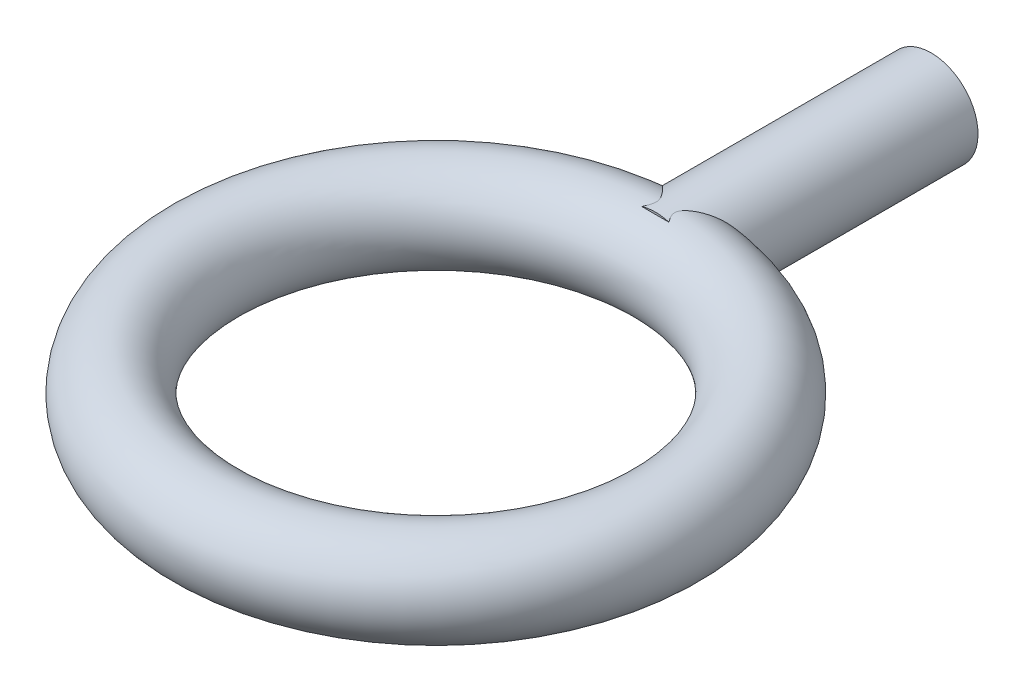
ISO-10303-21;
HEADER;
FILE_DESCRIPTION(('STEP AP214'),'2;1');
FILE_NAME('part.step','',(''),(''),'','','');
FILE_SCHEMA(('AUTOMOTIVE_DESIGN { 1 0 10303 214 1 1 1 1 }'));
ENDSEC;
DATA;
#1=APPLICATION_CONTEXT('core data for automotive mechanical design processes');
#2=APPLICATION_PROTOCOL_DEFINITION('international standard','automotive_design',2000,#1);
#3=PRODUCT_CONTEXT('',#1,'mechanical');
#4=PRODUCT('Part','Part','',(#3));
#5=PRODUCT_RELATED_PRODUCT_CATEGORY('part','',(#4));
#6=PRODUCT_DEFINITION_FORMATION('','',#4);
#7=PRODUCT_DEFINITION_CONTEXT('part definition',#1,'design');
#8=PRODUCT_DEFINITION('design','',#6,#7);
#9=PRODUCT_DEFINITION_SHAPE('','',#8);
#10=(LENGTH_UNIT() NAMED_UNIT(*) SI_UNIT(.MILLI.,.METRE.));
#11=(NAMED_UNIT(*) PLANE_ANGLE_UNIT() SI_UNIT($,.RADIAN.));
#12=(NAMED_UNIT(*) SI_UNIT($,.STERADIAN.) SOLID_ANGLE_UNIT());
#13=UNCERTAINTY_MEASURE_WITH_UNIT(LENGTH_MEASURE(1.E-05),#10,'distance_accuracy_value','');
#14=(GEOMETRIC_REPRESENTATION_CONTEXT(3) GLOBAL_UNCERTAINTY_ASSIGNED_CONTEXT((#13)) GLOBAL_UNIT_ASSIGNED_CONTEXT((#10,
#11,#12)) REPRESENTATION_CONTEXT('',''));
#15=CARTESIAN_POINT('',(0.,0.,0.));
#16=DIRECTION('',(0.,0.,1.));
#17=DIRECTION('',(1.,0.,0.));
#18=AXIS2_PLACEMENT_3D('',#15,#16,#17);
#19=CARTESIAN_POINT('',(-9448.78040350969,-4713.39551359016,184.88063334922));
#20=DIRECTION('',(0.,1.,0.));
#21=DIRECTION('',(1.,0.,0.));
#22=AXIS2_PLACEMENT_3D('',#19,#20,#21);
#23=TOROIDAL_SURFACE('',#22,25.0000000000005,5.00000000000071);
#24=CARTESIAN_POINT('',(-9447.30944943714,-4718.27878033655,161.));
#25=CARTESIAN_POINT('',(-9447.55459893969,-4718.27544619155,161.));
#26=CARTESIAN_POINT('',(-9447.79975997464,-4718.27290227472,161.));
#27=CARTESIAN_POINT('',(-9448.29008184333,-4718.2694816374,161.));
#28=CARTESIAN_POINT('',(-9448.53524267651,-4718.26860483711,161.));
#29=CARTESIAN_POINT('',(-9449.02556434288,-4718.26860483711,161.));
#30=CARTESIAN_POINT('',(-9449.27072517606,-4718.2694816374,161.));
#31=CARTESIAN_POINT('',(-9449.76104704475,-4718.27290227472,161.));
#32=CARTESIAN_POINT('',(-9450.0062080797,-4718.27544619155,161.));
#33=CARTESIAN_POINT('',(-9450.25135758225,-4718.27878033655,161.));
#34=B_SPLINE_CURVE_WITH_KNOTS('',3,(#24,#25,#26,#27,#28,#29,#30,#31,#32,#33),.UNSPECIFIED.,.F.,
.F.,(4,2,2,2,4),(0.,0.735516484941491,1.47099776904942,2.20647905315912,2.94199553810061),.UNSPECIFIED.);
#35=CARTESIAN_POINT('',(-9447.30944943714,-4718.27878033655,161.000000000001));
#36=VERTEX_POINT('',#35);
#37=CARTESIAN_POINT('',(-9450.25135758225,-4718.27878033655,160.999999999999));
#38=VERTEX_POINT('',#37);
#39=EDGE_CURVE('E26',#36,#38,#34,.T.);
#40=ORIENTED_EDGE('',*,*,#39,.F.);
#41=CARTESIAN_POINT('',(-9447.30944943715,-4708.51224684376,161.000000000008));
#42=CARTESIAN_POINT('',(-9447.33903761673,-4708.50333309246,160.957562420116));
#43=CARTESIAN_POINT('',(-9447.36820722333,-4708.49484234722,160.914762244065));
#44=CARTESIAN_POINT('',(-9447.42539862697,-4708.47872091877,160.828119411262));
#45=CARTESIAN_POINT('',(-9447.45341800728,-4708.47109199279,160.784274837682));
#46=CARTESIAN_POINT('',(-9447.53649792305,-4708.44920365253,160.648682296249));
#47=CARTESIAN_POINT('',(-9447.58902489208,-4708.4364035728,160.555023601684));
#48=CARTESIAN_POINT('',(-9447.66435790302,-4708.41902929248,160.394366248359));
#49=CARTESIAN_POINT('',(-9447.69114605554,-4708.4131425815,160.329429780656));
#50=CARTESIAN_POINT('',(-9447.73512578985,-4708.40373002261,160.196584489065));
#51=CARTESIAN_POINT('',(-9447.7523922944,-4708.40018569803,160.128703540749));
#52=CARTESIAN_POINT('',(-9447.77187577721,-4708.39621747477,160.002399481328));
#53=CARTESIAN_POINT('',(-9447.77614797412,-4708.39536641084,159.944324085666));
#54=CARTESIAN_POINT('',(-9447.77447450423,-4708.39570286402,159.828328584058));
#55=CARTESIAN_POINT('',(-9447.76852964131,-4708.39689022077,159.770408466255));
#56=CARTESIAN_POINT('',(-9447.74447649301,-4708.40181411022,159.640377603409));
#57=CARTESIAN_POINT('',(-9447.72341728568,-4708.40617372111,159.568857748581));
#58=CARTESIAN_POINT('',(-9447.6708053969,-4708.4176115032,159.429866407007));
#59=CARTESIAN_POINT('',(-9447.63919679043,-4708.42470419479,159.362418807975));
#60=CARTESIAN_POINT('',(-9447.5542593564,-4708.44483716139,159.202547262555));
#61=CARTESIAN_POINT('',(-9447.49748814823,-4708.45912146114,159.112163816446));
#62=CARTESIAN_POINT('',(-9447.3771263745,-4708.49196821408,158.936793222484));
#63=CARTESIAN_POINT('',(-9447.31351944144,-4708.51054106352,158.851819838819));
#64=CARTESIAN_POINT('',(-9447.18227313178,-4708.55188464423,158.685372950133));
#65=CARTESIAN_POINT('',(-9447.11461402137,-4708.57467727968,158.603920576379));
#66=CARTESIAN_POINT('',(-9446.97732092495,-4708.62432579034,158.444157622314));
#67=CARTESIAN_POINT('',(-9446.90768897499,-4708.65117759215,158.365843990815));
#68=CARTESIAN_POINT('',(-9446.70374077535,-4708.73521728249,158.141761267105));
#69=CARTESIAN_POINT('',(-9446.56804459318,-4708.79782858307,157.999242054888));
#70=CARTESIAN_POINT('',(-9446.29682078204,-4708.93846877123,157.721633195896));
#71=CARTESIAN_POINT('',(-9446.16129339718,-4709.01651082618,157.586550021173));
#72=CARTESIAN_POINT('',(-9445.89351732705,-4709.18824794384,157.324364232755));
#73=CARTESIAN_POINT('',(-9445.76125869373,-4709.2818863383,157.197234939974));
#74=CARTESIAN_POINT('',(-9445.5019155322,-4709.48543713469,156.951205624107));
#75=CARTESIAN_POINT('',(-9445.37482778887,-4709.59533922083,156.832300454239));
#76=CARTESIAN_POINT('',(-9445.07600481118,-4709.8817688946,156.555575108096));
#77=CARTESIAN_POINT('',(-9444.90798019993,-4710.06687411321,156.402428975922));
#78=CARTESIAN_POINT('',(-9444.594431931,-4710.47097211993,156.119603232386));
#79=CARTESIAN_POINT('',(-9444.44888600661,-4710.68993093769,155.989900376832));
#80=CARTESIAN_POINT('',(-9444.21050820354,-4711.12044277107,155.779023044446));
#81=CARTESIAN_POINT('',(-9444.11293139495,-4711.32711285862,155.693360574929));
#82=CARTESIAN_POINT('',(-9443.98665447325,-4711.65096310493,155.582975189822));
#83=CARTESIAN_POINT('',(-9443.94790095442,-4711.76125853453,155.549190137937));
#84=CARTESIAN_POINT('',(-9443.87767862639,-4711.98586543795,155.488083241158));
#85=CARTESIAN_POINT('',(-9443.8462067007,-4712.10017516945,155.460758631114));
#86=CARTESIAN_POINT('',(-9443.79091131746,-4712.33280255866,155.412814883419));
#87=CARTESIAN_POINT('',(-9443.76713727832,-4712.45114092422,155.392239060692));
#88=CARTESIAN_POINT('',(-9443.72796310668,-4712.69017417318,155.358364337804));
#89=CARTESIAN_POINT('',(-9443.7125591851,-4712.81086796463,155.345062144925));
#90=CARTESIAN_POINT('',(-9443.69041645015,-4713.05362720266,155.325947823345));
#91=CARTESIAN_POINT('',(-9443.68367680368,-4713.17569251623,155.320134974514));
#92=CARTESIAN_POINT('',(-9443.67899862129,-4713.42011175764,155.316099614594));
#93=CARTESIAN_POINT('',(-9443.68105935348,-4713.54246566064,155.317876472303));
#94=CARTESIAN_POINT('',(-9443.6932979095,-4713.7742859702,155.328435781431));
#95=CARTESIAN_POINT('',(-9443.70265255648,-4713.88382986226,155.336507792651));
#96=CARTESIAN_POINT('',(-9443.72831744475,-4714.10151803997,155.358674100103));
#97=CARTESIAN_POINT('',(-9443.74462990476,-4714.20966186782,155.372770317339));
#98=CARTESIAN_POINT('',(-9443.78394791048,-4714.42374887789,155.406790792478));
#99=CARTESIAN_POINT('',(-9443.80695084797,-4714.52969290046,155.42671277927));
#100=CARTESIAN_POINT('',(-9443.85930292495,-4714.73879589766,155.472129752645));
#101=CARTESIAN_POINT('',(-9443.88865444395,-4714.84195381167,155.49762682887));
#102=CARTESIAN_POINT('',(-9443.9867724157,-4715.14992393764,155.583034373733));
#103=CARTESIAN_POINT('',(-9444.06491436011,-4715.34956425077,155.651269489411));
#104=CARTESIAN_POINT('',(-9444.2418682176,-4715.73133841656,155.806734841394));
#105=CARTESIAN_POINT('',(-9444.34068601273,-4715.91346726582,155.893970483428));
#106=CARTESIAN_POINT('',(-9444.52264961513,-4716.20650947593,156.055839757581));
#107=CARTESIAN_POINT('',(-9444.60158047725,-4716.32237584292,156.126381885924));
#108=CARTESIAN_POINT('',(-9444.76624451561,-4716.54442663973,156.274442206407));
#109=CARTESIAN_POINT('',(-9444.85197986745,-4716.65060794942,156.351962630794));
#110=CARTESIAN_POINT('',(-9445.11802148595,-4716.95495028223,156.594194164234));
#111=CARTESIAN_POINT('',(-9445.30685732808,-4717.13843114039,156.768305525499));
#112=CARTESIAN_POINT('',(-9445.62753140314,-4717.40752226204,157.069881082635));
#113=CARTESIAN_POINT('',(-9445.75547903759,-4717.50461423681,157.191636620477));
#114=CARTESIAN_POINT('',(-9446.01496066544,-4717.68353425414,157.442578632246));
#115=CARTESIAN_POINT('',(-9446.14649663229,-4717.76535369524,157.57176924033));
#116=CARTESIAN_POINT('',(-9446.41024582985,-4717.91383066599,157.836716531889));
#117=CARTESIAN_POINT('',(-9446.54245449586,-4717.98054542114,157.972445987266));
#118=CARTESIAN_POINT('',(-9446.80514276796,-4718.0996616894,158.251492493087));
#119=CARTESIAN_POINT('',(-9446.9356237956,-4718.15207576884,158.394802749025));
#120=CARTESIAN_POINT('',(-9447.13357279754,-4718.22290228676,158.626537265018));
#121=CARTESIAN_POINT('',(-9447.20351910996,-4718.24613129057,158.71138536426));
#122=CARTESIAN_POINT('',(-9447.33948349026,-4718.28824523334,158.88607039278));
#123=CARTESIAN_POINT('',(-9447.40547822334,-4718.30710595593,158.975931859379));
#124=CARTESIAN_POINT('',(-9447.53040570251,-4718.34037992361,159.16376757283));
#125=CARTESIAN_POINT('',(-9447.58918821253,-4718.35470605974,159.261859628681));
#126=CARTESIAN_POINT('',(-9447.68835850479,-4718.3774841263,159.46727745636));
#127=CARTESIAN_POINT('',(-9447.72895907986,-4718.3860046538,159.574477942888));
#128=CARTESIAN_POINT('',(-9447.765280553,-4718.39348498807,159.74616960413));
#129=CARTESIAN_POINT('',(-9447.77302237578,-4718.39503232899,159.80785859238));
#130=CARTESIAN_POINT('',(-9447.77684622424,-4718.39580118316,159.931576761239));
#131=CARTESIAN_POINT('',(-9447.77293564193,-4718.39502417093,159.993605701269));
#132=CARTESIAN_POINT('',(-9447.7524471772,-4718.39085410138,160.130576212345));
#133=CARTESIAN_POINT('',(-9447.73306046229,-4718.38687921098,160.205053411579));
#134=CARTESIAN_POINT('',(-9447.68323182424,-4718.37616162304,160.350549176941));
#135=CARTESIAN_POINT('',(-9447.65267756131,-4718.36939070573,160.421523970317));
#136=CARTESIAN_POINT('',(-9447.57433431222,-4718.35106308725,160.581712389187));
#137=CARTESIAN_POINT('',(-9447.52414872796,-4718.3386705566,160.669621007936));
#138=CARTESIAN_POINT('',(-9447.44528344843,-4718.3177270466,160.797066458597));
#139=CARTESIAN_POINT('',(-9447.41879725205,-4718.31047222303,160.838257062376));
#140=CARTESIAN_POINT('',(-9447.3648129131,-4718.29519594104,160.919739848418));
#141=CARTESIAN_POINT('',(-9447.33731627832,-4718.28717559847,160.960033235891));
#142=CARTESIAN_POINT('',(-9447.30944943714,-4718.27878033655,161.000000000002));
#143=B_SPLINE_CURVE_WITH_KNOTS('',3,(#41,#42,#43,#44,#45,#46,#47,#48,#49,#50,#51,#52,#53,#54,
#55,#56,#57,#58,#59,#60,#61,#62,#63,#64,#65,#66,#67,#68,#69,#70,#71,#72,#73,#74,#75,#76,#77,#78,
#79,#80,#81,#82,#83,#84,#85,#86,#87,#88,#89,#90,#91,#92,#93,#94,#95,#96,#97,#98,#99,#100,#101,
#102,#103,#104,#105,#106,#107,#108,#109,#110,#111,#112,#113,#114,#115,#116,#117,#118,#119,#120,
#121,#122,#123,#124,#125,#126,#127,#128,#129,#130,#131,#132,#133,#134,#135,#136,#137,#138,#139,
#140,#141,#142),.UNSPECIFIED.,.F.,.F.,(4,2,2,2,2,2,2,2,2,2,2,2,2,2,2,2,2,2,2,2,2,2,2,2,2,2,2,2,
2,2,2,2,2,2,2,2,2,2,2,2,2,2,2,2,2,2,2,2,2,2,4),(0.,0.157448450916207,0.315212353302046,
0.638803870081451,0.849807036323482,1.05912529262953,1.23295511469861,1.40677126038031,
1.62947728289162,1.85338319216691,2.17562659583058,2.49865953615247,2.82341885366418,
3.14785440968087,3.7665849841779,4.38584583028893,5.0029038476564,5.61957213975953,
6.49568025533015,7.37091487979263,8.09981026815847,8.46449339988881,8.82902015897188,
9.19584270934776,9.56249906412587,9.92912016084125,10.2957107679963,10.6260352415575,
10.9564651279786,11.286766371365,11.6171916303794,12.2892486156102,12.9614970542456,
13.4317178325402,13.9020895652943,14.8446964295472,15.4487229445937,16.0530886267304,
16.6551248011441,17.2566302365458,17.5936326915517,17.9324609043048,18.2774503415342,
18.6182893259175,18.8037875352837,18.9891680938185,19.2189357224442,19.4510813410273,
19.7564208624658,19.9049306771762,20.0532272287011),.UNSPECIFIED.);
#144=CARTESIAN_POINT('',(-9447.30944943715,-4708.51224684376,161.000000000004));
#145=VERTEX_POINT('',#144);
#146=EDGE_CURVE('E35',#145,#36,#143,.T.);
#147=ORIENTED_EDGE('',*,*,#146,.F.);
#148=CARTESIAN_POINT('',(-9447.30944943714,-4708.51224684376,161.));
#149=CARTESIAN_POINT('',(-9447.55459893969,-4708.51558098877,161.));
#150=CARTESIAN_POINT('',(-9447.79975997464,-4708.51812490559,161.));
#151=CARTESIAN_POINT('',(-9448.29008184333,-4708.52154554292,161.));
#152=CARTESIAN_POINT('',(-9448.53524267651,-4708.52242234321,161.));
#153=CARTESIAN_POINT('',(-9449.02556434288,-4708.52242234321,161.));
#154=CARTESIAN_POINT('',(-9449.27072517606,-4708.52154554292,161.));
#155=CARTESIAN_POINT('',(-9449.76104704475,-4708.51812490559,161.));
#156=CARTESIAN_POINT('',(-9450.0062080797,-4708.51558098877,161.));
#157=CARTESIAN_POINT('',(-9450.25135758225,-4708.51224684376,161.));
#158=B_SPLINE_CURVE_WITH_KNOTS('',3,(#148,#149,#150,#151,#152,#153,#154,#155,#156,#157),
.UNSPECIFIED.,.F.,.F.,(4,2,2,2,4),(0.,0.735516484941491,1.47099776904942,2.20647905315912,
2.94199553810061),.UNSPECIFIED.);
#159=CARTESIAN_POINT('',(-9450.25135758225,-4708.51224684376,161.000000000002));
#160=VERTEX_POINT('',#159);
#161=EDGE_CURVE('E9',#145,#160,#158,.T.);
#162=ORIENTED_EDGE('',*,*,#161,.T.);
#163=CARTESIAN_POINT('',(-9450.25135758225,-4718.27878033656,160.999999999998));
#164=CARTESIAN_POINT('',(-9450.22176940267,-4718.28769408786,160.957562420106));
#165=CARTESIAN_POINT('',(-9450.19259979608,-4718.2961848331,160.914762244054));
#166=CARTESIAN_POINT('',(-9450.13540839243,-4718.31230626155,160.828119411251));
#167=CARTESIAN_POINT('',(-9450.10738901213,-4718.31993518752,160.784274837671));
#168=CARTESIAN_POINT('',(-9450.02430909636,-4718.34182352778,160.648682296238));
#169=CARTESIAN_POINT('',(-9449.97178212734,-4718.35462360752,160.555023601672));
#170=CARTESIAN_POINT('',(-9449.8964491164,-4718.37199788784,160.394366248346));
#171=CARTESIAN_POINT('',(-9449.86966096387,-4718.37788459882,160.329429780642));
#172=CARTESIAN_POINT('',(-9449.82568122956,-4718.3872971577,160.196584489051));
#173=CARTESIAN_POINT('',(-9449.80841472502,-4718.39084148229,160.128703540734));
#174=CARTESIAN_POINT('',(-9449.78893124221,-4718.39480970554,160.002399481312));
#175=CARTESIAN_POINT('',(-9449.7846590453,-4718.39566076948,159.944324085648));
#176=CARTESIAN_POINT('',(-9449.7863325152,-4718.39532431629,159.828328584038));
#177=CARTESIAN_POINT('',(-9449.79227737812,-4718.39413695955,159.770408466234));
#178=CARTESIAN_POINT('',(-9449.81633052642,-4718.3892130701,159.640377603383));
#179=CARTESIAN_POINT('',(-9449.83738973375,-4718.38485345921,159.568857748552));
#180=CARTESIAN_POINT('',(-9449.89000162253,-4718.37341567712,159.429866406973));
#181=CARTESIAN_POINT('',(-9449.92161022901,-4718.36632298552,159.362418807938));
#182=CARTESIAN_POINT('',(-9450.00654766305,-4718.34619001892,159.202547262509));
#183=CARTESIAN_POINT('',(-9450.06331887122,-4718.33190571916,159.112163816394));
#184=CARTESIAN_POINT('',(-9450.18368064496,-4718.29905896622,158.936793222422));
#185=CARTESIAN_POINT('',(-9450.24728757802,-4718.28048611678,158.851819838752));
#186=CARTESIAN_POINT('',(-9450.3785338877,-4718.23914253606,158.685372950057));
#187=CARTESIAN_POINT('',(-9450.44619299812,-4718.21634990061,158.603920576297));
#188=CARTESIAN_POINT('',(-9450.58348609455,-4718.16670138994,158.444157622222));
#189=CARTESIAN_POINT('',(-9450.65311804451,-4718.13984958813,158.365843990718));
#190=CARTESIAN_POINT('',(-9450.85706624416,-4718.05580989778,158.141761267007));
#191=CARTESIAN_POINT('',(-9450.99276242631,-4717.9931985972,157.999242054794));
#192=CARTESIAN_POINT('',(-9451.26398623745,-4717.85255840903,157.721633195807));
#193=CARTESIAN_POINT('',(-9451.39951362231,-4717.77451635408,157.586550021086));
#194=CARTESIAN_POINT('',(-9451.66728969244,-4717.60277923642,157.324364232673));
#195=CARTESIAN_POINT('',(-9451.79954832576,-4717.50914084195,157.197234939895));
#196=CARTESIAN_POINT('',(-9452.05889148728,-4717.30559004555,156.951205624033));
#197=CARTESIAN_POINT('',(-9452.18597923061,-4717.19568795942,156.832300454169));
#198=CARTESIAN_POINT('',(-9452.4848022083,-4716.90925828564,156.555575108033));
#199=CARTESIAN_POINT('',(-9452.65282681954,-4716.72415306703,156.402428975865));
#200=CARTESIAN_POINT('',(-9452.96637508845,-4716.3200550603,156.11960323234));
#201=CARTESIAN_POINT('',(-9453.11192101284,-4716.10109624254,155.98990037679));
#202=CARTESIAN_POINT('',(-9453.3502988159,-4715.67058440916,155.779023044413));
#203=CARTESIAN_POINT('',(-9453.44787562449,-4715.46391432162,155.693360574899));
#204=CARTESIAN_POINT('',(-9453.57415254618,-4715.1400640753,155.582975189799));
#205=CARTESIAN_POINT('',(-9453.612906065,-4715.02976864571,155.549190137915));
#206=CARTESIAN_POINT('',(-9453.68312839303,-4714.80516174229,155.488083241139));
#207=CARTESIAN_POINT('',(-9453.71460031872,-4714.69085201078,155.460758631097));
#208=CARTESIAN_POINT('',(-9453.76989570196,-4714.45822462158,155.412814883406));
#209=CARTESIAN_POINT('',(-9453.79366974109,-4714.33988625602,155.392239060681));
#210=CARTESIAN_POINT('',(-9453.83284391273,-4714.10085300705,155.358364337797));
#211=CARTESIAN_POINT('',(-9453.84824783431,-4713.98015921561,155.345062144919));
#212=CARTESIAN_POINT('',(-9453.87039056925,-4713.73739997758,155.325947823342));
#213=CARTESIAN_POINT('',(-9453.87713021572,-4713.61533466401,155.320134974514));
#214=CARTESIAN_POINT('',(-9453.88180839811,-4713.3709154226,155.316099614596));
#215=CARTESIAN_POINT('',(-9453.87974766592,-4713.24856151961,155.317876472306));
#216=CARTESIAN_POINT('',(-9453.86750910989,-4713.01674121005,155.328435781438));
#217=CARTESIAN_POINT('',(-9453.85815446292,-4712.90719731799,155.336507792659));
#218=CARTESIAN_POINT('',(-9453.83248957464,-4712.68950914028,155.358674100113));
#219=CARTESIAN_POINT('',(-9453.81617711463,-4712.58136531243,155.372770317351));
#220=CARTESIAN_POINT('',(-9453.7768591089,-4712.36727830236,155.406790792492));
#221=CARTESIAN_POINT('',(-9453.75385617141,-4712.26133427979,155.426712779285));
#222=CARTESIAN_POINT('',(-9453.70150409443,-4712.05223128259,155.472129752662));
#223=CARTESIAN_POINT('',(-9453.67215257543,-4711.94907336858,155.497626828888));
#224=CARTESIAN_POINT('',(-9453.57403460368,-4711.64110324261,155.583034373754));
#225=CARTESIAN_POINT('',(-9453.49589265926,-4711.44146292948,155.651269489435));
#226=CARTESIAN_POINT('',(-9453.31893880177,-4711.0596887637,155.806734841422));
#227=CARTESIAN_POINT('',(-9453.22012100663,-4710.87755991443,155.893970483458));
#228=CARTESIAN_POINT('',(-9453.03815740423,-4710.58451770433,156.055839757615));
#229=CARTESIAN_POINT('',(-9452.9592265421,-4710.46865133734,156.12638188596));
#230=CARTESIAN_POINT('',(-9452.79456250374,-4710.24660054053,156.274442206447));
#231=CARTESIAN_POINT('',(-9452.7088271519,-4710.14041923084,156.351962630836));
#232=CARTESIAN_POINT('',(-9452.4427855334,-4709.83607689804,156.594194164282));
#233=CARTESIAN_POINT('',(-9452.25394969126,-4709.65259603988,156.768305525551));
#234=CARTESIAN_POINT('',(-9451.93327561619,-4709.38350491823,157.069881082692));
#235=CARTESIAN_POINT('',(-9451.80532798174,-4709.28641294347,157.191636620535));
#236=CARTESIAN_POINT('',(-9451.54584635388,-4709.10749292613,157.442578632307));
#237=CARTESIAN_POINT('',(-9451.41431038704,-4709.02567348503,157.571769240394));
#238=CARTESIAN_POINT('',(-9451.15056118947,-4708.87719651429,157.836716531957));
#239=CARTESIAN_POINT('',(-9451.01835252346,-4708.81048175915,157.972445987337));
#240=CARTESIAN_POINT('',(-9450.75566425136,-4708.69136549088,158.251492493163));
#241=CARTESIAN_POINT('',(-9450.62518322372,-4708.63895141145,158.394802749103));
#242=CARTESIAN_POINT('',(-9450.42723422178,-4708.56812489354,158.626537265096));
#243=CARTESIAN_POINT('',(-9450.35728790937,-4708.54489588972,158.711385364333));
#244=CARTESIAN_POINT('',(-9450.22132352908,-4708.50278194696,158.886070392848));
#245=CARTESIAN_POINT('',(-9450.155328796,-4708.48392122438,158.975931859445));
#246=CARTESIAN_POINT('',(-9450.03040131683,-4708.4506472567,159.163767572891));
#247=CARTESIAN_POINT('',(-9449.97161880682,-4708.43632112056,159.261859628739));
#248=CARTESIAN_POINT('',(-9449.87244851457,-4708.41354305401,159.467277456412));
#249=CARTESIAN_POINT('',(-9449.8318479395,-4708.40502252651,159.574477942936));
#250=CARTESIAN_POINT('',(-9449.79552646637,-4708.39754219224,159.746169604173));
#251=CARTESIAN_POINT('',(-9449.78778464359,-4708.39599485132,159.807858592422));
#252=CARTESIAN_POINT('',(-9449.78396079514,-4708.39522599715,159.931576761279));
#253=CARTESIAN_POINT('',(-9449.78787137745,-4708.39600300938,159.993605701307));
#254=CARTESIAN_POINT('',(-9449.80835984218,-4708.40017307893,160.130576212384));
#255=CARTESIAN_POINT('',(-9449.8277465571,-4708.40414796934,160.20505341162));
#256=CARTESIAN_POINT('',(-9449.87757519516,-4708.41486555728,160.350549176985));
#257=CARTESIAN_POINT('',(-9449.90812945809,-4708.42163647459,160.421523970362));
#258=CARTESIAN_POINT('',(-9449.98647270719,-4708.43996409307,160.581712389225));
#259=CARTESIAN_POINT('',(-9450.03665829144,-4708.45235662372,160.669621007966));
#260=CARTESIAN_POINT('',(-9450.11552357097,-4708.47330013372,160.797066458616));
#261=CARTESIAN_POINT('',(-9450.14200976735,-4708.48055495729,160.838257062391));
#262=CARTESIAN_POINT('',(-9450.19599410629,-4708.49583123928,160.919739848426));
#263=CARTESIAN_POINT('',(-9450.22349074107,-4708.50385158185,160.960033235896));
#264=CARTESIAN_POINT('',(-9450.25135758224,-4708.51224684376,161.000000000004));
#265=B_SPLINE_CURVE_WITH_KNOTS('',3,(#163,#164,#165,#166,#167,#168,#169,#170,#171,#172,#173,
#174,#175,#176,#177,#178,#179,#180,#181,#182,#183,#184,#185,#186,#187,#188,#189,#190,#191,#192,
#193,#194,#195,#196,#197,#198,#199,#200,#201,#202,#203,#204,#205,#206,#207,#208,#209,#210,#211,
#212,#213,#214,#215,#216,#217,#218,#219,#220,#221,#222,#223,#224,#225,#226,#227,#228,#229,#230,
#231,#232,#233,#234,#235,#236,#237,#238,#239,#240,#241,#242,#243,#244,#245,#246,#247,#248,#249,
#250,#251,#252,#253,#254,#255,#256,#257,#258,#259,#260,#261,#262,#263,#264),.UNSPECIFIED.,.F.,
.F.,(4,2,2,2,2,2,2,2,2,2,2,2,2,2,2,2,2,2,2,2,2,2,2,2,2,2,2,2,2,2,2,2,2,2,2,2,2,2,2,2,2,2,2,2,2,
2,2,2,2,2,4),(0.,0.157448450917453,0.315212353301779,0.638803870080117,0.849807036322691,
1.05912529262886,1.2329551147018,1.40677126038738,1.62947728290929,1.85338319219533,
2.17562659588271,2.49865953622655,2.82341885376188,3.14785440980182,3.76658498429131,
4.38584583039854,5.00290384776081,5.61957213985715,6.49568025541369,7.37091487986117,
8.0998102682205,8.46449339994784,8.82902015902833,9.19584270939931,9.56249906417511,
9.92912016088819,10.2957107680389,10.6260352415973,10.9564651280188,11.286766371404,
11.6171916304166,12.2892486156511,12.9614970542892,13.4317178325902,13.9020895653499,
14.8446964296133,15.4487229446617,16.0530886268032,16.6551248012252,17.2566302366316,
17.5936326916214,17.9324609043607,18.2774503415758,18.618289325944,18.8037875353059,
18.9891680938368,19.218935722471,19.4510813410619,19.7564208624757,19.9049306771755,
20.0532272286874),.UNSPECIFIED.);
#266=EDGE_CURVE('E41',#38,#160,#265,.T.);
#267=ORIENTED_EDGE('',*,*,#266,.F.);
#268=EDGE_LOOP('',(#40,#147,#162,#267));
#269=FACE_BOUND('',#268,.T.);
#270=ADVANCED_FACE('F15',(#269),#23,.T.);
#271=CARTESIAN_POINT('',(-9449.8847105265,-4718.52974569766,161.));
#272=DIRECTION('',(0.,0.,1.));
#273=DIRECTION('',(1.,0.,0.));
#274=AXIS2_PLACEMENT_3D('',#271,#272,#273);
#275=PLANE('',#274);
#276=ORIENTED_EDGE('',*,*,#39,.T.);
#277=CARTESIAN_POINT('',(-9448.7804035097,-4713.39551359016,161.));
#278=DIRECTION('',(0.,0.,1.));
#279=DIRECTION('',(1.,0.,0.));
#280=AXIS2_PLACEMENT_3D('',#277,#278,#279);
#281=CIRCLE('',#280,5.10000000000099);
#282=EDGE_CURVE('E47',#36,#38,#281,.F.);
#283=ORIENTED_EDGE('',*,*,#282,.F.);
#284=EDGE_LOOP('',(#276,#283));
#285=FACE_BOUND('',#284,.T.);
#286=ADVANCED_FACE('F51',(#285),#275,.T.);
#287=CARTESIAN_POINT('',(-9449.8847105265,-4708.53242234321,161.));
#288=DIRECTION('',(0.,0.,1.));
#289=DIRECTION('',(1.,0.,0.));
#290=AXIS2_PLACEMENT_3D('',#287,#288,#289);
#291=PLANE('',#290);
#292=ORIENTED_EDGE('',*,*,#161,.F.);
#293=CARTESIAN_POINT('',(-9448.7804035097,-4713.39551359016,161.));
#294=DIRECTION('',(0.,0.,1.));
#295=DIRECTION('',(1.,0.,0.));
#296=AXIS2_PLACEMENT_3D('',#293,#294,#295);
#297=CIRCLE('',#296,5.10000000000099);
#298=EDGE_CURVE('E48',#160,#145,#297,.F.);
#299=ORIENTED_EDGE('',*,*,#298,.F.);
#300=EDGE_LOOP('',(#292,#299));
#301=FACE_BOUND('',#300,.T.);
#302=ADVANCED_FACE('F74',(#301),#291,.T.);
#303=CARTESIAN_POINT('',(-9448.7804035097,-4713.39551359016,161.));
#304=DIRECTION('',(0.,0.,-1.));
#305=DIRECTION('',(0.,-1.,0.));
#306=AXIS2_PLACEMENT_3D('',#303,#304,#305);
#307=CYLINDRICAL_SURFACE('',#306,5.10000000000099);
#308=ORIENTED_EDGE('',*,*,#282,.T.);
#309=ORIENTED_EDGE('',*,*,#266,.T.);
#310=ORIENTED_EDGE('',*,*,#298,.T.);
#311=ORIENTED_EDGE('',*,*,#146,.T.);
#312=EDGE_LOOP('',(#308,#309,#310,#311));
#313=FACE_BOUND('',#312,.T.);
#314=CARTESIAN_POINT('',(-9448.7804035097,-4713.39551359016,131.));
#315=DIRECTION('',(0.,0.,-1.));
#316=DIRECTION('',(-1.,0.,0.));
#317=AXIS2_PLACEMENT_3D('',#314,#315,#316);
#318=CIRCLE('',#317,5.10000000000099);
#319=CARTESIAN_POINT('',(-9453.8804035097,-4713.39551359016,131.));
#320=VERTEX_POINT('',#319);
#321=EDGE_CURVE('E20',#320,#320,#318,.T.);
#322=ORIENTED_EDGE('',*,*,#321,.F.);
#323=EDGE_LOOP('',(#322));
#324=FACE_BOUND('',#323,.T.);
#325=ADVANCED_FACE('F17',(#313,#324),#307,.T.);
#326=CARTESIAN_POINT('',(-9453.7904035097,-4718.40551359016,131.));
#327=DIRECTION('',(0.,0.,-1.));
#328=DIRECTION('',(-1.,0.,0.));
#329=AXIS2_PLACEMENT_3D('',#326,#327,#328);
#330=PLANE('',#329);
#331=ORIENTED_EDGE('',*,*,#321,.T.);
#332=EDGE_LOOP('',(#331));
#333=FACE_BOUND('',#332,.T.);
#334=ADVANCED_FACE('F78',(#333),#330,.T.);
#335=CLOSED_SHELL('',(#270,#286,#302,#325,#334));
#336=MANIFOLD_SOLID_BREP('B1',#335);
#337=ADVANCED_BREP_SHAPE_REPRESENTATION('',(#18,#336),#14);
#338=SHAPE_DEFINITION_REPRESENTATION(#9,#337);
ENDSEC;
END-ISO-10303-21;
